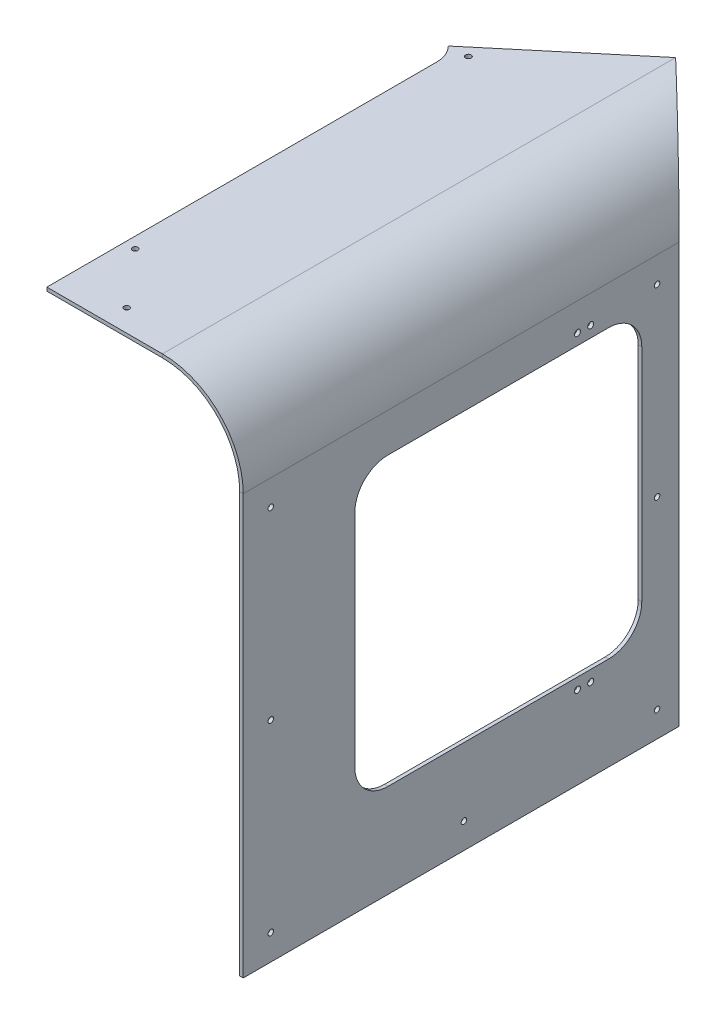
ISO-10303-21;
HEADER;
FILE_DESCRIPTION(('STEP AP214'),'2;1');
FILE_NAME('part.step','',(''),(''),'','','');
FILE_SCHEMA(('AUTOMOTIVE_DESIGN { 1 0 10303 214 1 1 1 1 }'));
ENDSEC;
DATA;
#1=APPLICATION_CONTEXT('core data for automotive mechanical design processes');
#2=APPLICATION_PROTOCOL_DEFINITION('international standard','automotive_design',2000,#1);
#3=PRODUCT_CONTEXT('',#1,'mechanical');
#4=PRODUCT('Part','Part','',(#3));
#5=PRODUCT_RELATED_PRODUCT_CATEGORY('part','',(#4));
#6=PRODUCT_DEFINITION_FORMATION('','',#4);
#7=PRODUCT_DEFINITION_CONTEXT('part definition',#1,'design');
#8=PRODUCT_DEFINITION('design','',#6,#7);
#9=PRODUCT_DEFINITION_SHAPE('','',#8);
#10=(LENGTH_UNIT() NAMED_UNIT(*) SI_UNIT(.MILLI.,.METRE.));
#11=(NAMED_UNIT(*) PLANE_ANGLE_UNIT() SI_UNIT($,.RADIAN.));
#12=(NAMED_UNIT(*) SI_UNIT($,.STERADIAN.) SOLID_ANGLE_UNIT());
#13=UNCERTAINTY_MEASURE_WITH_UNIT(LENGTH_MEASURE(1.E-05),#10,'distance_accuracy_value','');
#14=(GEOMETRIC_REPRESENTATION_CONTEXT(3) GLOBAL_UNCERTAINTY_ASSIGNED_CONTEXT((#13)) GLOBAL_UNIT_ASSIGNED_CONTEXT((#10,
#11,#12)) REPRESENTATION_CONTEXT('',''));
#15=CARTESIAN_POINT('',(0.,0.,0.));
#16=DIRECTION('',(0.,0.,1.));
#17=DIRECTION('',(1.,0.,0.));
#18=AXIS2_PLACEMENT_3D('',#15,#16,#17);
#19=CARTESIAN_POINT('',(320.,84.7775730559616,-265.));
#20=DIRECTION('',(0.,-1.,0.));
#21=DIRECTION('',(0.,0.,-1.));
#22=AXIS2_PLACEMENT_3D('',#19,#20,#21);
#23=PLANE('',#22);
#24=DIRECTION('',(-1.,0.,0.));
#25=VECTOR('',#24,1.);
#26=CARTESIAN_POINT('',(320.,84.7775730559616,138.869715749511));
#27=LINE('',#26,#25);
#28=CARTESIAN_POINT('',(323.2,84.7775730559616,138.869715749511));
#29=VERTEX_POINT('',#28);
#30=CARTESIAN_POINT('',(320.,84.7775730559616,138.869715749511));
#31=VERTEX_POINT('',#30);
#32=EDGE_CURVE('E11',#29,#31,#27,.T.);
#33=ORIENTED_EDGE('',*,*,#32,.F.);
#34=DIRECTION('',(0.,0.,-1.));
#35=VECTOR('',#34,1.);
#36=CARTESIAN_POINT('',(323.2,84.7775730559616,-265.));
#37=LINE('',#36,#35);
#38=CARTESIAN_POINT('',(323.2,84.7775730559616,-61.1302842504891));
#39=VERTEX_POINT('',#38);
#40=EDGE_CURVE('E139',#29,#39,#37,.T.);
#41=ORIENTED_EDGE('',*,*,#40,.T.);
#42=DIRECTION('',(-1.,0.,0.));
#43=VECTOR('',#42,1.);
#44=CARTESIAN_POINT('',(320.,84.7775730559616,-61.1302842504891));
#45=LINE('',#44,#43);
#46=CARTESIAN_POINT('',(320.,84.7775730559616,-61.1302842504891));
#47=VERTEX_POINT('',#46);
#48=EDGE_CURVE('E51',#39,#47,#45,.T.);
#49=ORIENTED_EDGE('',*,*,#48,.T.);
#50=DIRECTION('',(0.,0.,-1.));
#51=VECTOR('',#50,1.);
#52=CARTESIAN_POINT('',(320.,84.7775730559616,-265.));
#53=LINE('',#52,#51);
#54=EDGE_CURVE('E209',#31,#47,#53,.T.);
#55=ORIENTED_EDGE('',*,*,#54,.F.);
#56=EDGE_LOOP('',(#33,#41,#49,#55));
#57=FACE_BOUND('',#56,.T.);
#58=ADVANCED_FACE('F41',(#57),#23,.F.);
#59=CARTESIAN_POINT('',(320.,114.777573055962,-61.1302842504891));
#60=DIRECTION('',(1.,0.,0.));
#61=DIRECTION('',(0.,0.,-1.));
#62=AXIS2_PLACEMENT_3D('',#59,#60,#61);
#63=CYLINDRICAL_SURFACE('',#62,30.);
#64=ORIENTED_EDGE('',*,*,#48,.F.);
#65=CARTESIAN_POINT('',(323.2,114.777573055962,-61.1302842504891));
#66=DIRECTION('',(1.,0.,0.));
#67=DIRECTION('',(0.,0.,-1.));
#68=AXIS2_PLACEMENT_3D('',#65,#66,#67);
#69=CIRCLE('',#68,30.);
#70=CARTESIAN_POINT('',(323.2,114.777573055962,-91.1302842504891));
#71=VERTEX_POINT('',#70);
#72=EDGE_CURVE('E164',#39,#71,#69,.T.);
#73=ORIENTED_EDGE('',*,*,#72,.T.);
#74=DIRECTION('',(-1.,0.,0.));
#75=VECTOR('',#74,1.);
#76=CARTESIAN_POINT('',(320.,114.777573055962,-91.1302842504892));
#77=LINE('',#76,#75);
#78=CARTESIAN_POINT('',(320.,114.777573055962,-91.1302842504892));
#79=VERTEX_POINT('',#78);
#80=EDGE_CURVE('E202',#71,#79,#77,.T.);
#81=ORIENTED_EDGE('',*,*,#80,.T.);
#82=CARTESIAN_POINT('',(320.,114.777573055962,-61.1302842504891));
#83=DIRECTION('',(1.,0.,0.));
#84=DIRECTION('',(0.,0.,-1.));
#85=AXIS2_PLACEMENT_3D('',#82,#83,#84);
#86=CIRCLE('',#85,30.);
#87=EDGE_CURVE('E219',#47,#79,#86,.T.);
#88=ORIENTED_EDGE('',*,*,#87,.F.);
#89=EDGE_LOOP('',(#64,#73,#81,#88));
#90=FACE_BOUND('',#89,.T.);
#91=ADVANCED_FACE('F222',(#90),#63,.F.);
#92=CARTESIAN_POINT('',(320.,450.,-91.1302842504891));
#93=DIRECTION('',(0.,0.,-1.));
#94=DIRECTION('',(0.,1.,0.));
#95=AXIS2_PLACEMENT_3D('',#92,#93,#94);
#96=PLANE('',#95);
#97=ORIENTED_EDGE('',*,*,#80,.F.);
#98=DIRECTION('',(0.,1.,0.));
#99=VECTOR('',#98,1.);
#100=CARTESIAN_POINT('',(323.2,450.,-91.1302842504891));
#101=LINE('',#100,#99);
#102=CARTESIAN_POINT('',(323.2,314.777573055962,-91.1302842504891));
#103=VERTEX_POINT('',#102);
#104=EDGE_CURVE('E161',#71,#103,#101,.T.);
#105=ORIENTED_EDGE('',*,*,#104,.T.);
#106=DIRECTION('',(-1.,0.,0.));
#107=VECTOR('',#106,1.);
#108=CARTESIAN_POINT('',(320.,314.777573055962,-91.1302842504891));
#109=LINE('',#108,#107);
#110=CARTESIAN_POINT('',(320.,314.777573055962,-91.1302842504891));
#111=VERTEX_POINT('',#110);
#112=EDGE_CURVE('E199',#103,#111,#109,.T.);
#113=ORIENTED_EDGE('',*,*,#112,.T.);
#114=DIRECTION('',(0.,1.,0.));
#115=VECTOR('',#114,1.);
#116=CARTESIAN_POINT('',(320.,450.,-91.1302842504891));
#117=LINE('',#116,#115);
#118=EDGE_CURVE('E223',#79,#111,#117,.T.);
#119=ORIENTED_EDGE('',*,*,#118,.F.);
#120=EDGE_LOOP('',(#97,#105,#113,#119));
#121=FACE_BOUND('',#120,.T.);
#122=ADVANCED_FACE('F378',(#121),#96,.F.);
#123=CARTESIAN_POINT('',(320.,314.777573055962,-61.1302842504891));
#124=DIRECTION('',(1.,0.,0.));
#125=DIRECTION('',(0.,0.,-1.));
#126=AXIS2_PLACEMENT_3D('',#123,#124,#125);
#127=CYLINDRICAL_SURFACE('',#126,30.);
#128=ORIENTED_EDGE('',*,*,#112,.F.);
#129=CARTESIAN_POINT('',(323.2,314.777573055962,-61.1302842504891));
#130=DIRECTION('',(1.,0.,0.));
#131=DIRECTION('',(0.,0.,-1.));
#132=AXIS2_PLACEMENT_3D('',#129,#130,#131);
#133=CIRCLE('',#132,30.);
#134=CARTESIAN_POINT('',(323.2,344.777573055962,-61.1302842504891));
#135=VERTEX_POINT('',#134);
#136=EDGE_CURVE('E158',#103,#135,#133,.T.);
#137=ORIENTED_EDGE('',*,*,#136,.T.);
#138=DIRECTION('',(-1.,0.,0.));
#139=VECTOR('',#138,1.);
#140=CARTESIAN_POINT('',(320.,344.777573055962,-61.1302842504891));
#141=LINE('',#140,#139);
#142=CARTESIAN_POINT('',(320.,344.777573055962,-61.1302842504891));
#143=VERTEX_POINT('',#142);
#144=EDGE_CURVE('E196',#135,#143,#141,.T.);
#145=ORIENTED_EDGE('',*,*,#144,.T.);
#146=CARTESIAN_POINT('',(320.,314.777573055962,-61.1302842504891));
#147=DIRECTION('',(1.,0.,0.));
#148=DIRECTION('',(0.,0.,-1.));
#149=AXIS2_PLACEMENT_3D('',#146,#147,#148);
#150=CIRCLE('',#149,30.);
#151=EDGE_CURVE('E225',#111,#143,#150,.T.);
#152=ORIENTED_EDGE('',*,*,#151,.F.);
#153=EDGE_LOOP('',(#128,#137,#145,#152));
#154=FACE_BOUND('',#153,.T.);
#155=ADVANCED_FACE('F384',(#154),#127,.F.);
#156=CARTESIAN_POINT('',(320.,344.777573055962,-265.));
#157=DIRECTION('',(0.,1.,0.));
#158=DIRECTION('',(0.,0.,1.));
#159=AXIS2_PLACEMENT_3D('',#156,#157,#158);
#160=PLANE('',#159);
#161=ORIENTED_EDGE('',*,*,#144,.F.);
#162=DIRECTION('',(0.,0.,-1.));
#163=VECTOR('',#162,1.);
#164=CARTESIAN_POINT('',(323.2,344.777573055962,-265.));
#165=LINE('',#164,#163);
#166=CARTESIAN_POINT('',(323.2,344.777573055962,138.869715749511));
#167=VERTEX_POINT('',#166);
#168=EDGE_CURVE('E155',#135,#167,#165,.F.);
#169=ORIENTED_EDGE('',*,*,#168,.T.);
#170=DIRECTION('',(-1.,0.,0.));
#171=VECTOR('',#170,1.);
#172=CARTESIAN_POINT('',(320.,344.777573055962,138.869715749511));
#173=LINE('',#172,#171);
#174=CARTESIAN_POINT('',(320.,344.777573055962,138.869715749511));
#175=VERTEX_POINT('',#174);
#176=EDGE_CURVE('E193',#167,#175,#173,.T.);
#177=ORIENTED_EDGE('',*,*,#176,.T.);
#178=DIRECTION('',(0.,0.,1.));
#179=VECTOR('',#178,1.);
#180=CARTESIAN_POINT('',(320.,344.777573055962,-265.));
#181=LINE('',#180,#179);
#182=EDGE_CURVE('E231',#143,#175,#181,.T.);
#183=ORIENTED_EDGE('',*,*,#182,.F.);
#184=EDGE_LOOP('',(#161,#169,#177,#183));
#185=FACE_BOUND('',#184,.T.);
#186=ADVANCED_FACE('F387',(#185),#160,.F.);
#187=CARTESIAN_POINT('',(320.,314.777573055962,138.869715749511));
#188=DIRECTION('',(1.,0.,0.));
#189=DIRECTION('',(0.,0.,-1.));
#190=AXIS2_PLACEMENT_3D('',#187,#188,#189);
#191=CYLINDRICAL_SURFACE('',#190,30.);
#192=ORIENTED_EDGE('',*,*,#176,.F.);
#193=CARTESIAN_POINT('',(323.2,314.777573055962,138.869715749511));
#194=DIRECTION('',(1.,0.,0.));
#195=DIRECTION('',(0.,0.,-1.));
#196=AXIS2_PLACEMENT_3D('',#193,#194,#195);
#197=CIRCLE('',#196,30.);
#198=CARTESIAN_POINT('',(323.2,314.777573055962,168.869715749511));
#199=VERTEX_POINT('',#198);
#200=EDGE_CURVE('E152',#167,#199,#197,.T.);
#201=ORIENTED_EDGE('',*,*,#200,.T.);
#202=DIRECTION('',(-1.,0.,0.));
#203=VECTOR('',#202,1.);
#204=CARTESIAN_POINT('',(320.,314.777573055962,168.869715749511));
#205=LINE('',#204,#203);
#206=CARTESIAN_POINT('',(320.,314.777573055962,168.869715749511));
#207=VERTEX_POINT('',#206);
#208=EDGE_CURVE('E129',#199,#207,#205,.T.);
#209=ORIENTED_EDGE('',*,*,#208,.T.);
#210=CARTESIAN_POINT('',(320.,314.777573055962,138.869715749511));
#211=DIRECTION('',(1.,0.,0.));
#212=DIRECTION('',(0.,0.,-1.));
#213=AXIS2_PLACEMENT_3D('',#210,#211,#212);
#214=CIRCLE('',#213,30.);
#215=EDGE_CURVE('E234',#175,#207,#214,.T.);
#216=ORIENTED_EDGE('',*,*,#215,.F.);
#217=EDGE_LOOP('',(#192,#201,#209,#216));
#218=FACE_BOUND('',#217,.T.);
#219=ADVANCED_FACE('F389',(#218),#191,.F.);
#220=CARTESIAN_POINT('',(320.,450.,168.869715749511));
#221=DIRECTION('',(0.,0.,1.));
#222=DIRECTION('',(0.,-1.,0.));
#223=AXIS2_PLACEMENT_3D('',#220,#221,#222);
#224=PLANE('',#223);
#225=ORIENTED_EDGE('',*,*,#208,.F.);
#226=DIRECTION('',(0.,1.,0.));
#227=VECTOR('',#226,1.);
#228=CARTESIAN_POINT('',(323.2,450.,168.869715749511));
#229=LINE('',#228,#227);
#230=CARTESIAN_POINT('',(323.2,114.777573055962,168.869715749511));
#231=VERTEX_POINT('',#230);
#232=EDGE_CURVE('E136',#199,#231,#229,.F.);
#233=ORIENTED_EDGE('',*,*,#232,.T.);
#234=DIRECTION('',(-1.,0.,0.));
#235=VECTOR('',#234,1.);
#236=CARTESIAN_POINT('',(320.,114.777573055962,168.869715749511));
#237=LINE('',#236,#235);
#238=CARTESIAN_POINT('',(320.,114.777573055962,168.869715749511));
#239=VERTEX_POINT('',#238);
#240=EDGE_CURVE('E45',#231,#239,#237,.T.);
#241=ORIENTED_EDGE('',*,*,#240,.T.);
#242=DIRECTION('',(0.,-1.,0.));
#243=VECTOR('',#242,1.);
#244=CARTESIAN_POINT('',(320.,450.,168.869715749511));
#245=LINE('',#244,#243);
#246=EDGE_CURVE('E311',#207,#239,#245,.T.);
#247=ORIENTED_EDGE('',*,*,#246,.F.);
#248=EDGE_LOOP('',(#225,#233,#241,#247));
#249=FACE_BOUND('',#248,.T.);
#250=ADVANCED_FACE('F141',(#249),#224,.F.);
#251=CARTESIAN_POINT('',(145.271732748,450.,195.));
#252=DIRECTION('',(1.,0.,0.));
#253=DIRECTION('',(0.,0.,-1.));
#254=AXIS2_PLACEMENT_3D('',#251,#252,#253);
#255=PLANE('',#254);
#256=DIRECTION('',(0.,-1.,0.));
#257=VECTOR('',#256,1.);
#258=CARTESIAN_POINT('',(145.271732748,450.,270.));
#259=LINE('',#258,#257);
#260=CARTESIAN_POINT('',(145.271732748,453.2,270.));
#261=VERTEX_POINT('',#260);
#262=CARTESIAN_POINT('',(145.271732748,450.,270.));
#263=VERTEX_POINT('',#262);
#264=EDGE_CURVE('E130',#261,#263,#259,.T.);
#265=ORIENTED_EDGE('',*,*,#264,.F.);
#266=DIRECTION('',(0.,0.,1.));
#267=VECTOR('',#266,1.);
#268=CARTESIAN_POINT('',(145.271732748,453.2,195.));
#269=LINE('',#268,#267);
#270=CARTESIAN_POINT('',(145.271732748,453.2,-83.3962275514645));
#271=VERTEX_POINT('',#270);
#272=EDGE_CURVE('E315',#261,#271,#269,.F.);
#273=ORIENTED_EDGE('',*,*,#272,.T.);
#274=DIRECTION('',(0.,-1.,0.));
#275=VECTOR('',#274,1.);
#276=CARTESIAN_POINT('',(145.271732748,450.,-83.3962275514645));
#277=LINE('',#276,#275);
#278=CARTESIAN_POINT('',(145.271732748,450.,-83.3962275514645));
#279=VERTEX_POINT('',#278);
#280=EDGE_CURVE('E185',#271,#279,#277,.T.);
#281=ORIENTED_EDGE('',*,*,#280,.T.);
#282=DIRECTION('',(0.,0.,-1.));
#283=VECTOR('',#282,1.);
#284=CARTESIAN_POINT('',(145.271732748,450.,195.));
#285=LINE('',#284,#283);
#286=EDGE_CURVE('E268',#263,#279,#285,.T.);
#287=ORIENTED_EDGE('',*,*,#286,.F.);
#288=EDGE_LOOP('',(#265,#273,#281,#287));
#289=FACE_BOUND('',#288,.T.);
#290=ADVANCED_FACE('F342',(#289),#255,.F.);
#291=CARTESIAN_POINT('',(120.271732748,450.,-83.3962275514645));
#292=DIRECTION('',(0.,1.,0.));
#293=DIRECTION('',(0.,0.,1.));
#294=AXIS2_PLACEMENT_3D('',#291,#292,#293);
#295=CYLINDRICAL_SURFACE('',#294,25.);
#296=ORIENTED_EDGE('',*,*,#280,.F.);
#297=CARTESIAN_POINT('',(120.271732748,453.2,-83.3962275514645));
#298=DIRECTION('',(0.,1.,0.));
#299=DIRECTION('',(0.,0.,1.));
#300=AXIS2_PLACEMENT_3D('',#297,#298,#299);
#301=CIRCLE('',#300,25.);
#302=CARTESIAN_POINT('',(137.949402277664,453.2,-101.073897081128));
#303=VERTEX_POINT('',#302);
#304=EDGE_CURVE('E297',#271,#303,#301,.T.);
#305=ORIENTED_EDGE('',*,*,#304,.T.);
#306=DIRECTION('',(0.,-1.,0.));
#307=VECTOR('',#306,1.);
#308=CARTESIAN_POINT('',(137.949402277664,450.,-101.073897081128));
#309=LINE('',#308,#307);
#310=CARTESIAN_POINT('',(137.949402277664,450.,-101.073897081128));
#311=VERTEX_POINT('',#310);
#312=EDGE_CURVE('E59',#303,#311,#309,.T.);
#313=ORIENTED_EDGE('',*,*,#312,.T.);
#314=CARTESIAN_POINT('',(120.271732748,450.,-83.3962275514645));
#315=DIRECTION('',(0.,1.,0.));
#316=DIRECTION('',(0.,0.,1.));
#317=AXIS2_PLACEMENT_3D('',#314,#315,#316);
#318=CIRCLE('',#317,25.);
#319=EDGE_CURVE('E273',#279,#311,#318,.T.);
#320=ORIENTED_EDGE('',*,*,#319,.F.);
#321=EDGE_LOOP('',(#296,#305,#313,#320));
#322=FACE_BOUND('',#321,.T.);
#323=ADVANCED_FACE('F339',(#322),#295,.F.);
#324=CARTESIAN_POINT('',(-235.661957548569,450.,212.104789583773));
#325=DIRECTION('',(-0.642404184639349,0.,-0.766366011483973));
#326=DIRECTION('',(-0.766366011483973,0.,0.642404184639349));
#327=AXIS2_PLACEMENT_3D('',#324,#325,#326);
#328=PLANE('',#327);
#329=ORIENTED_EDGE('',*,*,#312,.F.);
#330=DIRECTION('',(-0.766366011483973,0.,0.642404184639349));
#331=VECTOR('',#330,1.);
#332=CARTESIAN_POINT('',(-235.661957548569,453.2,212.104789583773));
#333=LINE('',#332,#331);
#334=CARTESIAN_POINT('',(250.,453.2,-195.));
#335=VERTEX_POINT('',#334);
#336=EDGE_CURVE('E291',#335,#303,#333,.T.);
#337=ORIENTED_EDGE('',*,*,#336,.F.);
#338=DIRECTION('',(0.,-1.,0.));
#339=VECTOR('',#338,1.);
#340=CARTESIAN_POINT('',(250.,450.,-195.));
#341=LINE('',#340,#339);
#342=CARTESIAN_POINT('',(250.,450.,-195.));
#343=VERTEX_POINT('',#342);
#344=EDGE_CURVE('E181',#335,#343,#341,.T.);
#345=ORIENTED_EDGE('',*,*,#344,.T.);
#346=DIRECTION('',(-0.766366011483973,0.,0.642404184639349));
#347=VECTOR('',#346,1.);
#348=CARTESIAN_POINT('',(-235.661957548569,450.,212.104789583773));
#349=LINE('',#348,#347);
#350=EDGE_CURVE('E258',#343,#311,#349,.T.);
#351=ORIENTED_EDGE('',*,*,#350,.T.);
#352=EDGE_LOOP('',(#329,#337,#345,#351));
#353=FACE_BOUND('',#352,.T.);
#354=ADVANCED_FACE('F510',(#353),#328,.T.);
#355=CARTESIAN_POINT('',(323.2,380.,-125.));
#356=CARTESIAN_POINT('',(322.133333333333,380.,-125.));
#357=CARTESIAN_POINT('',(321.066666666667,380.,-125.));
#358=CARTESIAN_POINT('',(320.,380.,-125.));
#359=CARTESIAN_POINT('',(323.2,526.4,-125.));
#360=CARTESIAN_POINT('',(322.133333333333,524.266666666667,-125.));
#361=CARTESIAN_POINT('',(321.066666666667,522.133333333334,-125.));
#362=CARTESIAN_POINT('',(320.,520.,-125.));
#363=CARTESIAN_POINT('',(176.8,526.4,-265.));
#364=CARTESIAN_POINT('',(177.866666666667,524.266666666667,-265.));
#365=CARTESIAN_POINT('',(178.933333333333,522.133333333334,-265.));
#366=CARTESIAN_POINT('',(180.,520.,-265.));
#367=CARTESIAN_POINT('',(176.8,380.,-265.));
#368=CARTESIAN_POINT('',(177.866666666667,380.,-265.));
#369=CARTESIAN_POINT('',(178.933333333333,380.,-265.));
#370=CARTESIAN_POINT('',(180.,380.,-265.));
#371=CARTESIAN_POINT('',(176.8,233.6,-265.));
#372=CARTESIAN_POINT('',(177.866666666667,235.733333333333,-265.));
#373=CARTESIAN_POINT('',(178.933333333333,237.866666666667,-265.));
#374=CARTESIAN_POINT('',(180.,240.,-265.));
#375=CARTESIAN_POINT('',(323.2,233.6,-125.));
#376=CARTESIAN_POINT('',(322.133333333333,235.733333333333,-125.));
#377=CARTESIAN_POINT('',(321.066666666667,237.866666666667,-125.));
#378=CARTESIAN_POINT('',(320.,240.,-125.));
#379=CARTESIAN_POINT('',(323.2,380.,-125.));
#380=CARTESIAN_POINT('',(322.133333333333,380.,-125.));
#381=CARTESIAN_POINT('',(321.066666666667,380.,-125.));
#382=CARTESIAN_POINT('',(320.,380.,-125.));
#383=(BOUNDED_SURFACE() B_SPLINE_SURFACE(3,3,((#355,#356,#357,#358),(#359,#360,#361,#362),(#363,
#364,#365,#366),(#367,#368,#369,#370),(#371,#372,#373,#374),(#375,#376,#377,#378),(#379,#380,
#381,#382)),.UNSPECIFIED.,.T.,.F.,.F.) B_SPLINE_SURFACE_WITH_KNOTS((4,3,4),(4,4),(0.,0.5,1.),
(0.,1.),.UNSPECIFIED.) GEOMETRIC_REPRESENTATION_ITEM() RATIONAL_B_SPLINE_SURFACE(((1.,1.,1.,1.),
(0.333333333333333,0.333333333333333,0.333333333333333,0.333333333333333),(0.333333333333333,
0.333333333333333,0.333333333333333,0.333333333333333),(1.,1.,1.,1.),(0.333333333333333,
0.333333333333333,0.333333333333333,0.333333333333333),(0.333333333333333,0.333333333333333,
0.333333333333333,0.333333333333333),(1.,1.,1.,1.))) REPRESENTATION_ITEM('') SURFACE());
#384=CARTESIAN_POINT('',(250.,380.,-195.));
#385=DIRECTION('',(0.691132971722828,0.,-0.722727621858729));
#386=DIRECTION('',(0.722727621858729,0.,0.691132971722828));
#387=AXIS2_PLACEMENT_3D('',#384,#385,#386);
#388=ELLIPSE('',#387,101.282969940657,73.2);
#389=CARTESIAN_POINT('',(323.2,380.,-125.));
#390=VERTEX_POINT('',#389);
#391=EDGE_CURVE('E296',#390,#335,#388,.F.);
#392=DIRECTION('',(-1.,0.,0.));
#393=VECTOR('',#392,1.);
#394=CARTESIAN_POINT('',(320.,380.,-125.));
#395=LINE('',#394,#393);
#396=CARTESIAN_POINT('',(320.,380.,-125.));
#397=VERTEX_POINT('',#396);
#398=EDGE_CURVE('E178',#390,#397,#395,.T.);
#399=CARTESIAN_POINT('',(250.,380.,-195.));
#400=DIRECTION('',(0.707106781186547,0.,-0.707106781186548));
#401=DIRECTION('',(0.707106781186548,0.,0.707106781186547));
#402=AXIS2_PLACEMENT_3D('',#399,#400,#401);
#403=ELLIPSE('',#402,98.9949493661167,70.);
#404=EDGE_CURVE('E191',#397,#343,#403,.F.);
#405=ORIENTED_EDGE('',*,*,#344,.F.);
#406=ORIENTED_EDGE('',*,*,#391,.F.);
#407=ORIENTED_EDGE('',*,*,#398,.T.);
#408=ORIENTED_EDGE('',*,*,#404,.T.);
#409=EDGE_LOOP('',(#405,#406,#407,#408));
#410=FACE_BOUND('',#409,.T.);
#411=ADVANCED_FACE('F515',(#410),#383,.F.);
#412=CARTESIAN_POINT('',(320.,2193.73346549275,-125.));
#413=DIRECTION('',(0.,0.,1.));
#414=DIRECTION('',(0.,-1.,0.));
#415=AXIS2_PLACEMENT_3D('',#412,#413,#414);
#416=PLANE('',#415);
#417=ORIENTED_EDGE('',*,*,#398,.F.);
#418=DIRECTION('',(0.,1.,0.));
#419=VECTOR('',#418,1.);
#420=CARTESIAN_POINT('',(323.2,450.,-125.));
#421=LINE('',#420,#419);
#422=CARTESIAN_POINT('',(323.2,8.88178419700125E-13,-125.));
#423=VERTEX_POINT('',#422);
#424=EDGE_CURVE('E285',#390,#423,#421,.F.);
#425=ORIENTED_EDGE('',*,*,#424,.T.);
#426=DIRECTION('',(-1.,0.,0.));
#427=VECTOR('',#426,1.);
#428=CARTESIAN_POINT('',(320.,8.88178419700125E-13,-125.));
#429=LINE('',#428,#427);
#430=CARTESIAN_POINT('',(320.,8.88178419700125E-13,-125.));
#431=VERTEX_POINT('',#430);
#432=EDGE_CURVE('E175',#423,#431,#429,.T.);
#433=ORIENTED_EDGE('',*,*,#432,.T.);
#434=DIRECTION('',(0.,-1.,0.));
#435=VECTOR('',#434,1.);
#436=CARTESIAN_POINT('',(320.,2193.73346549275,-125.));
#437=LINE('',#436,#435);
#438=EDGE_CURVE('E248',#397,#431,#437,.T.);
#439=ORIENTED_EDGE('',*,*,#438,.F.);
#440=EDGE_LOOP('',(#417,#425,#433,#439));
#441=FACE_BOUND('',#440,.T.);
#442=ADVANCED_FACE('F520',(#441),#416,.F.);
#443=CARTESIAN_POINT('',(320.,0.,-265.));
#444=DIRECTION('',(0.,1.,0.));
#445=DIRECTION('',(0.,0.,1.));
#446=AXIS2_PLACEMENT_3D('',#443,#444,#445);
#447=PLANE('',#446);
#448=ORIENTED_EDGE('',*,*,#432,.F.);
#449=DIRECTION('',(0.,0.,-1.));
#450=VECTOR('',#449,1.);
#451=CARTESIAN_POINT('',(323.2,8.88178419700125E-13,-265.));
#452=LINE('',#451,#450);
#453=CARTESIAN_POINT('',(323.2,0.,270.));
#454=VERTEX_POINT('',#453);
#455=EDGE_CURVE('E154',#423,#454,#452,.F.);
#456=ORIENTED_EDGE('',*,*,#455,.T.);
#457=DIRECTION('',(-1.,0.,0.));
#458=VECTOR('',#457,1.);
#459=CARTESIAN_POINT('',(320.,0.,270.));
#460=LINE('',#459,#458);
#461=CARTESIAN_POINT('',(320.,0.,270.));
#462=VERTEX_POINT('',#461);
#463=EDGE_CURVE('E171',#454,#462,#460,.T.);
#464=ORIENTED_EDGE('',*,*,#463,.T.);
#465=DIRECTION('',(0.,0.,1.));
#466=VECTOR('',#465,1.);
#467=CARTESIAN_POINT('',(320.,0.,-265.));
#468=LINE('',#467,#466);
#469=EDGE_CURVE('E237',#431,#462,#468,.T.);
#470=ORIENTED_EDGE('',*,*,#469,.F.);
#471=EDGE_LOOP('',(#448,#456,#464,#470));
#472=FACE_BOUND('',#471,.T.);
#473=ADVANCED_FACE('F529',(#472),#447,.F.);
#474=CARTESIAN_POINT('',(320.,0.,270.));
#475=DIRECTION('',(0.,0.,1.));
#476=DIRECTION('',(0.,-1.,0.));
#477=AXIS2_PLACEMENT_3D('',#474,#475,#476);
#478=PLANE('',#477);
#479=ORIENTED_EDGE('',*,*,#463,.F.);
#480=DIRECTION('',(0.,1.,0.));
#481=VECTOR('',#480,1.);
#482=CARTESIAN_POINT('',(323.2,450.,269.999999999309));
#483=LINE('',#482,#481);
#484=CARTESIAN_POINT('',(323.2,380.,269.999999999309));
#485=VERTEX_POINT('',#484);
#486=EDGE_CURVE('E286',#485,#454,#483,.F.);
#487=ORIENTED_EDGE('',*,*,#486,.F.);
#488=DIRECTION('',(-1.,0.,0.));
#489=VECTOR('',#488,1.);
#490=CARTESIAN_POINT('',(320.,380.,269.999999999309));
#491=LINE('',#490,#489);
#492=CARTESIAN_POINT('',(320.,380.,269.999999999309));
#493=VERTEX_POINT('',#492);
#494=EDGE_CURVE('E168',#485,#493,#491,.T.);
#495=ORIENTED_EDGE('',*,*,#494,.T.);
#496=DIRECTION('',(0.,-1.,0.));
#497=VECTOR('',#496,1.);
#498=CARTESIAN_POINT('',(320.,0.,270.));
#499=LINE('',#498,#497);
#500=EDGE_CURVE('E241',#493,#462,#499,.T.);
#501=ORIENTED_EDGE('',*,*,#500,.T.);
#502=EDGE_LOOP('',(#479,#487,#495,#501));
#503=FACE_BOUND('',#502,.T.);
#504=ADVANCED_FACE('F533',(#503),#478,.T.);
#505=CARTESIAN_POINT('',(250.,380.,269.999999998618));
#506=DIRECTION('',(0.,0.,-1.));
#507=DIRECTION('',(-1.,0.,0.));
#508=AXIS2_PLACEMENT_3D('',#505,#506,#507);
#509=PLANE('',#508);
#510=ORIENTED_EDGE('',*,*,#494,.F.);
#511=CARTESIAN_POINT('',(250.,380.,269.999999999309));
#512=DIRECTION('',(0.,0.,1.));
#513=DIRECTION('',(1.,0.,0.));
#514=AXIS2_PLACEMENT_3D('',#511,#512,#513);
#515=CIRCLE('',#514,73.2);
#516=CARTESIAN_POINT('',(250.,453.2,269.999999999309));
#517=VERTEX_POINT('',#516);
#518=EDGE_CURVE('E292',#517,#485,#515,.F.);
#519=ORIENTED_EDGE('',*,*,#518,.F.);
#520=DIRECTION('',(0.,-1.,0.));
#521=VECTOR('',#520,1.);
#522=CARTESIAN_POINT('',(250.,450.,269.999999999309));
#523=LINE('',#522,#521);
#524=CARTESIAN_POINT('',(250.,450.,269.999999999309));
#525=VERTEX_POINT('',#524);
#526=EDGE_CURVE('E172',#517,#525,#523,.T.);
#527=ORIENTED_EDGE('',*,*,#526,.T.);
#528=CARTESIAN_POINT('',(250.,380.,269.999999998618));
#529=DIRECTION('',(0.,0.,1.));
#530=DIRECTION('',(1.,0.,0.));
#531=AXIS2_PLACEMENT_3D('',#528,#529,#530);
#532=CIRCLE('',#531,70.);
#533=EDGE_CURVE('E275',#525,#493,#532,.F.);
#534=ORIENTED_EDGE('',*,*,#533,.T.);
#535=EDGE_LOOP('',(#510,#519,#527,#534));
#536=FACE_BOUND('',#535,.T.);
#537=ADVANCED_FACE('F537',(#536),#509,.F.);
#538=CARTESIAN_POINT('',(320.,114.777573055962,138.869715749511));
#539=DIRECTION('',(1.,0.,0.));
#540=DIRECTION('',(0.,0.,-1.));
#541=AXIS2_PLACEMENT_3D('',#538,#539,#540);
#542=CYLINDRICAL_SURFACE('',#541,30.);
#543=CARTESIAN_POINT('',(323.2,114.777573055962,138.869715749511));
#544=DIRECTION('',(1.,0.,0.));
#545=DIRECTION('',(0.,0.,-1.));
#546=AXIS2_PLACEMENT_3D('',#543,#544,#545);
#547=CIRCLE('',#546,30.);
#548=EDGE_CURVE('E122',#231,#29,#547,.T.);
#549=ORIENTED_EDGE('',*,*,#548,.T.);
#550=ORIENTED_EDGE('',*,*,#32,.T.);
#551=CARTESIAN_POINT('',(320.,114.777573055962,138.869715749511));
#552=DIRECTION('',(1.,0.,0.));
#553=DIRECTION('',(0.,0.,-1.));
#554=AXIS2_PLACEMENT_3D('',#551,#552,#553);
#555=CIRCLE('',#554,30.);
#556=EDGE_CURVE('E124',#239,#31,#555,.T.);
#557=ORIENTED_EDGE('',*,*,#556,.F.);
#558=ORIENTED_EDGE('',*,*,#240,.F.);
#559=EDGE_LOOP('',(#549,#550,#557,#558));
#560=FACE_BOUND('',#559,.T.);
#561=ADVANCED_FACE('F43',(#560),#542,.F.);
#562=CARTESIAN_POINT('',(155.271732748,450.,-101.960676968146));
#563=DIRECTION('',(0.,1.,0.));
#564=DIRECTION('',(0.,0.,1.));
#565=AXIS2_PLACEMENT_3D('',#562,#563,#564);
#566=CYLINDRICAL_SURFACE('',#565,2.5);
#567=CARTESIAN_POINT('',(155.271732748,450.,-101.960676968146));
#568=DIRECTION('',(0.,1.,0.));
#569=DIRECTION('',(0.,0.,1.));
#570=AXIS2_PLACEMENT_3D('',#567,#568,#569);
#571=CIRCLE('',#570,2.5);
#572=CARTESIAN_POINT('',(155.271732748,450.,-99.4606769681461));
#573=VERTEX_POINT('',#572);
#574=EDGE_CURVE('E252',#573,#573,#571,.T.);
#575=ORIENTED_EDGE('',*,*,#574,.F.);
#576=EDGE_LOOP('',(#575));
#577=FACE_BOUND('',#576,.T.);
#578=CARTESIAN_POINT('',(155.271732748,453.2,-101.960676968146));
#579=DIRECTION('',(0.,1.,0.));
#580=DIRECTION('',(0.,0.,1.));
#581=AXIS2_PLACEMENT_3D('',#578,#579,#580);
#582=CIRCLE('',#581,2.5);
#583=CARTESIAN_POINT('',(155.271732748,453.2,-99.4606769681461));
#584=VERTEX_POINT('',#583);
#585=EDGE_CURVE('E307',#584,#584,#582,.T.);
#586=ORIENTED_EDGE('',*,*,#585,.T.);
#587=EDGE_LOOP('',(#586));
#588=FACE_BOUND('',#587,.T.);
#589=ADVANCED_FACE('F479',(#577,#588),#566,.F.);
#590=CARTESIAN_POINT('',(155.271732748,450.,200.));
#591=DIRECTION('',(0.,1.,0.));
#592=DIRECTION('',(0.,0.,1.));
#593=AXIS2_PLACEMENT_3D('',#590,#591,#592);
#594=CYLINDRICAL_SURFACE('',#593,2.5);
#595=CARTESIAN_POINT('',(155.271732748,450.,200.));
#596=DIRECTION('',(0.,1.,0.));
#597=DIRECTION('',(0.,0.,1.));
#598=AXIS2_PLACEMENT_3D('',#595,#596,#597);
#599=CIRCLE('',#598,2.5);
#600=CARTESIAN_POINT('',(155.271732748,450.,202.5));
#601=VERTEX_POINT('',#600);
#602=EDGE_CURVE('E255',#601,#601,#599,.T.);
#603=ORIENTED_EDGE('',*,*,#602,.F.);
#604=EDGE_LOOP('',(#603));
#605=FACE_BOUND('',#604,.T.);
#606=CARTESIAN_POINT('',(155.271732748,453.2,200.));
#607=DIRECTION('',(0.,1.,0.));
#608=DIRECTION('',(0.,0.,1.));
#609=AXIS2_PLACEMENT_3D('',#606,#607,#608);
#610=CIRCLE('',#609,2.5);
#611=CARTESIAN_POINT('',(155.271732748,453.2,202.5));
#612=VERTEX_POINT('',#611);
#613=EDGE_CURVE('E150',#612,#612,#610,.T.);
#614=ORIENTED_EDGE('',*,*,#613,.T.);
#615=EDGE_LOOP('',(#614));
#616=FACE_BOUND('',#615,.T.);
#617=ADVANCED_FACE('F326',(#605,#616),#594,.F.);
#618=CARTESIAN_POINT('',(-250.,450.,270.));
#619=DIRECTION('',(0.,0.,1.));
#620=DIRECTION('',(1.,0.,0.));
#621=AXIS2_PLACEMENT_3D('',#618,#619,#620);
#622=PLANE('',#621);
#623=DIRECTION('',(1.,0.,0.));
#624=VECTOR('',#623,1.);
#625=CARTESIAN_POINT('',(-250.,453.2,270.));
#626=LINE('',#625,#624);
#627=EDGE_CURVE('E290',#261,#517,#626,.T.);
#628=ORIENTED_EDGE('',*,*,#627,.F.);
#629=ORIENTED_EDGE('',*,*,#264,.T.);
#630=DIRECTION('',(1.,0.,0.));
#631=VECTOR('',#630,1.);
#632=CARTESIAN_POINT('',(-250.,450.,270.));
#633=LINE('',#632,#631);
#634=EDGE_CURVE('E264',#263,#525,#633,.T.);
#635=ORIENTED_EDGE('',*,*,#634,.T.);
#636=ORIENTED_EDGE('',*,*,#526,.F.);
#637=EDGE_LOOP('',(#628,#629,#635,#636));
#638=FACE_BOUND('',#637,.T.);
#639=ADVANCED_FACE('F351',(#638),#622,.T.);
#640=CARTESIAN_POINT('',(250.,380.,-265.));
#641=DIRECTION('',(0.,0.,1.));
#642=DIRECTION('',(1.,0.,0.));
#643=AXIS2_PLACEMENT_3D('',#640,#641,#642);
#644=CYLINDRICAL_SURFACE('',#643,70.);
#645=DIRECTION('',(0.,0.,1.));
#646=VECTOR('',#645,1.);
#647=CARTESIAN_POINT('',(320.,380.,-265.));
#648=LINE('',#647,#646);
#649=EDGE_CURVE('E245',#397,#493,#648,.T.);
#650=ORIENTED_EDGE('',*,*,#649,.T.);
#651=ORIENTED_EDGE('',*,*,#533,.F.);
#652=DIRECTION('',(0.,0.,1.));
#653=VECTOR('',#652,1.);
#654=CARTESIAN_POINT('',(250.,450.,195.));
#655=LINE('',#654,#653);
#656=EDGE_CURVE('E261',#525,#343,#655,.F.);
#657=ORIENTED_EDGE('',*,*,#656,.T.);
#658=ORIENTED_EDGE('',*,*,#404,.F.);
#659=EDGE_LOOP('',(#650,#651,#657,#658));
#660=FACE_BOUND('',#659,.T.);
#661=ADVANCED_FACE('F472',(#660),#644,.F.);
#662=CARTESIAN_POINT('',(-250.,450.,195.));
#663=DIRECTION('',(0.,1.,0.));
#664=DIRECTION('',(0.,0.,1.));
#665=AXIS2_PLACEMENT_3D('',#662,#663,#664);
#666=PLANE('',#665);
#667=CARTESIAN_POINT('',(197.635866374,450.,250.));
#668=DIRECTION('',(0.,1.,0.));
#669=DIRECTION('',(0.,0.,1.));
#670=AXIS2_PLACEMENT_3D('',#667,#668,#669);
#671=CIRCLE('',#670,2.5);
#672=CARTESIAN_POINT('',(197.635866374,450.,252.5));
#673=VERTEX_POINT('',#672);
#674=EDGE_CURVE('E455',#673,#673,#671,.T.);
#675=ORIENTED_EDGE('',*,*,#674,.T.);
#676=EDGE_LOOP('',(#675));
#677=FACE_BOUND('',#676,.T.);
#678=ORIENTED_EDGE('',*,*,#574,.T.);
#679=EDGE_LOOP('',(#678));
#680=FACE_BOUND('',#679,.T.);
#681=ORIENTED_EDGE('',*,*,#602,.T.);
#682=EDGE_LOOP('',(#681));
#683=FACE_BOUND('',#682,.T.);
#684=ORIENTED_EDGE('',*,*,#350,.F.);
#685=ORIENTED_EDGE('',*,*,#656,.F.);
#686=ORIENTED_EDGE('',*,*,#634,.F.);
#687=ORIENTED_EDGE('',*,*,#286,.T.);
#688=ORIENTED_EDGE('',*,*,#319,.T.);
#689=EDGE_LOOP('',(#684,#685,#686,#687,#688));
#690=FACE_BOUND('',#689,.T.);
#691=ADVANCED_FACE('F346',(#677,#680,#683,#690),#666,.F.);
#692=CARTESIAN_POINT('',(320.,450.,-265.));
#693=DIRECTION('',(1.,0.,0.));
#694=DIRECTION('',(0.,0.,-1.));
#695=AXIS2_PLACEMENT_3D('',#692,#693,#694);
#696=PLANE('',#695);
#697=CARTESIAN_POINT('',(320.,356.825,-105.));
#698=DIRECTION('',(1.,0.,0.));
#699=DIRECTION('',(0.,0.,-1.));
#700=AXIS2_PLACEMENT_3D('',#697,#698,#699);
#701=CIRCLE('',#700,2.5);
#702=CARTESIAN_POINT('',(320.,356.825,-107.5));
#703=VERTEX_POINT('',#702);
#704=EDGE_CURVE('E449',#703,#703,#701,.T.);
#705=ORIENTED_EDGE('',*,*,#704,.T.);
#706=EDGE_LOOP('',(#705));
#707=FACE_BOUND('',#706,.T.);
#708=CARTESIAN_POINT('',(320.,190.,-105.));
#709=DIRECTION('',(1.,0.,0.));
#710=DIRECTION('',(0.,0.,-1.));
#711=AXIS2_PLACEMENT_3D('',#708,#709,#710);
#712=CIRCLE('',#711,2.50000000000001);
#713=CARTESIAN_POINT('',(320.,190.,-107.5));
#714=VERTEX_POINT('',#713);
#715=EDGE_CURVE('E443',#714,#714,#712,.T.);
#716=ORIENTED_EDGE('',*,*,#715,.T.);
#717=EDGE_LOOP('',(#716));
#718=FACE_BOUND('',#717,.T.);
#719=CARTESIAN_POINT('',(320.,190.,245.024999999309));
#720=DIRECTION('',(1.,0.,0.));
#721=DIRECTION('',(0.,0.,-1.));
#722=AXIS2_PLACEMENT_3D('',#719,#720,#721);
#723=CIRCLE('',#722,2.5);
#724=CARTESIAN_POINT('',(320.,190.,242.524999999309));
#725=VERTEX_POINT('',#724);
#726=EDGE_CURVE('E437',#725,#725,#723,.T.);
#727=ORIENTED_EDGE('',*,*,#726,.T.);
#728=EDGE_LOOP('',(#727));
#729=FACE_BOUND('',#728,.T.);
#730=CARTESIAN_POINT('',(320.,356.825,245.024999999309));
#731=DIRECTION('',(1.,0.,0.));
#732=DIRECTION('',(0.,0.,-1.));
#733=AXIS2_PLACEMENT_3D('',#730,#731,#732);
#734=CIRCLE('',#733,2.5);
#735=CARTESIAN_POINT('',(320.,356.825,242.524999999309));
#736=VERTEX_POINT('',#735);
#737=EDGE_CURVE('E431',#736,#736,#734,.T.);
#738=ORIENTED_EDGE('',*,*,#737,.T.);
#739=EDGE_LOOP('',(#738));
#740=FACE_BOUND('',#739,.T.);
#741=CARTESIAN_POINT('',(320.,23.1750000000009,-105.));
#742=DIRECTION('',(1.,0.,0.));
#743=DIRECTION('',(0.,0.,-1.));
#744=AXIS2_PLACEMENT_3D('',#741,#742,#743);
#745=CIRCLE('',#744,2.50000000000001);
#746=CARTESIAN_POINT('',(320.,23.1750000000009,-107.5));
#747=VERTEX_POINT('',#746);
#748=EDGE_CURVE('E425',#747,#747,#745,.T.);
#749=ORIENTED_EDGE('',*,*,#748,.T.);
#750=EDGE_LOOP('',(#749));
#751=FACE_BOUND('',#750,.T.);
#752=CARTESIAN_POINT('',(320.,23.1750000000009,70.0124999996544));
#753=DIRECTION('',(1.,0.,0.));
#754=DIRECTION('',(0.,0.,-1.));
#755=AXIS2_PLACEMENT_3D('',#752,#753,#754);
#756=CIRCLE('',#755,2.5);
#757=CARTESIAN_POINT('',(320.,23.1750000000009,67.5124999996544));
#758=VERTEX_POINT('',#757);
#759=EDGE_CURVE('E419',#758,#758,#756,.T.);
#760=ORIENTED_EDGE('',*,*,#759,.T.);
#761=EDGE_LOOP('',(#760));
#762=FACE_BOUND('',#761,.T.);
#763=CARTESIAN_POINT('',(320.,23.1750000000009,245.024999999309));
#764=DIRECTION('',(1.,0.,0.));
#765=DIRECTION('',(0.,0.,-1.));
#766=AXIS2_PLACEMENT_3D('',#763,#764,#765);
#767=CIRCLE('',#766,2.5);
#768=CARTESIAN_POINT('',(320.,23.1750000000009,242.524999999309));
#769=VERTEX_POINT('',#768);
#770=EDGE_CURVE('E413',#769,#769,#767,.T.);
#771=ORIENTED_EDGE('',*,*,#770,.T.);
#772=EDGE_LOOP('',(#771));
#773=FACE_BOUND('',#772,.T.);
#774=CARTESIAN_POINT('',(320.,354.777573121186,-32.8802842504893));
#775=DIRECTION('',(1.,0.,0.));
#776=DIRECTION('',(0.,0.,-1.));
#777=AXIS2_PLACEMENT_3D('',#774,#775,#776);
#778=CIRCLE('',#777,2.75);
#779=CARTESIAN_POINT('',(320.,354.777573121186,-35.6302842504893));
#780=VERTEX_POINT('',#779);
#781=EDGE_CURVE('E407',#780,#780,#778,.T.);
#782=ORIENTED_EDGE('',*,*,#781,.T.);
#783=EDGE_LOOP('',(#782));
#784=FACE_BOUND('',#783,.T.);
#785=CARTESIAN_POINT('',(320.,354.777573121186,-44.8802842504893));
#786=DIRECTION('',(1.,0.,0.));
#787=DIRECTION('',(0.,0.,-1.));
#788=AXIS2_PLACEMENT_3D('',#785,#786,#787);
#789=CIRCLE('',#788,2.75);
#790=CARTESIAN_POINT('',(320.,354.777573121186,-47.6302842504893));
#791=VERTEX_POINT('',#790);
#792=EDGE_CURVE('E401',#791,#791,#789,.T.);
#793=ORIENTED_EDGE('',*,*,#792,.T.);
#794=EDGE_LOOP('',(#793));
#795=FACE_BOUND('',#794,.T.);
#796=CARTESIAN_POINT('',(320.,74.7775730559616,-32.8802842504893));
#797=DIRECTION('',(1.,0.,0.));
#798=DIRECTION('',(0.,0.,-1.));
#799=AXIS2_PLACEMENT_3D('',#796,#797,#798);
#800=CIRCLE('',#799,2.75);
#801=CARTESIAN_POINT('',(320.,74.7775730559616,-35.6302842504893));
#802=VERTEX_POINT('',#801);
#803=EDGE_CURVE('E395',#802,#802,#800,.T.);
#804=ORIENTED_EDGE('',*,*,#803,.T.);
#805=EDGE_LOOP('',(#804));
#806=FACE_BOUND('',#805,.T.);
#807=CARTESIAN_POINT('',(320.,74.7775730559616,-44.8802842504893));
#808=DIRECTION('',(1.,0.,0.));
#809=DIRECTION('',(0.,0.,-1.));
#810=AXIS2_PLACEMENT_3D('',#807,#808,#809);
#811=CIRCLE('',#810,2.75);
#812=CARTESIAN_POINT('',(320.,74.7775730559616,-47.6302842504893));
#813=VERTEX_POINT('',#812);
#814=EDGE_CURVE('E143',#813,#813,#811,.T.);
#815=ORIENTED_EDGE('',*,*,#814,.T.);
#816=EDGE_LOOP('',(#815));
#817=FACE_BOUND('',#816,.T.);
#818=ORIENTED_EDGE('',*,*,#246,.T.);
#819=ORIENTED_EDGE('',*,*,#556,.T.);
#820=ORIENTED_EDGE('',*,*,#54,.T.);
#821=ORIENTED_EDGE('',*,*,#87,.T.);
#822=ORIENTED_EDGE('',*,*,#118,.T.);
#823=ORIENTED_EDGE('',*,*,#151,.T.);
#824=ORIENTED_EDGE('',*,*,#182,.T.);
#825=ORIENTED_EDGE('',*,*,#215,.T.);
#826=EDGE_LOOP('',(#818,#819,#820,#821,#822,#823,#824,#825));
#827=FACE_BOUND('',#826,.T.);
#828=ORIENTED_EDGE('',*,*,#469,.T.);
#829=ORIENTED_EDGE('',*,*,#500,.F.);
#830=ORIENTED_EDGE('',*,*,#649,.F.);
#831=ORIENTED_EDGE('',*,*,#438,.T.);
#832=EDGE_LOOP('',(#828,#829,#830,#831));
#833=FACE_BOUND('',#832,.T.);
#834=ADVANCED_FACE('F216',(#707,#718,#729,#740,#751,#762,#773,#784,#795,#806,#817,#827,#833),
#696,.F.);
#835=CARTESIAN_POINT('',(250.,380.,-265.));
#836=DIRECTION('',(0.,0.,1.));
#837=DIRECTION('',(1.,0.,0.));
#838=AXIS2_PLACEMENT_3D('',#835,#836,#837);
#839=CYLINDRICAL_SURFACE('',#838,73.2);
#840=DIRECTION('',(0.,0.,1.));
#841=VECTOR('',#840,1.);
#842=CARTESIAN_POINT('',(323.2,380.,-265.));
#843=LINE('',#842,#841);
#844=EDGE_CURVE('E282',#390,#485,#843,.T.);
#845=ORIENTED_EDGE('',*,*,#844,.F.);
#846=ORIENTED_EDGE('',*,*,#391,.T.);
#847=DIRECTION('',(0.,0.,1.));
#848=VECTOR('',#847,1.);
#849=CARTESIAN_POINT('',(250.,453.2,-265.));
#850=LINE('',#849,#848);
#851=EDGE_CURVE('E287',#517,#335,#850,.F.);
#852=ORIENTED_EDGE('',*,*,#851,.F.);
#853=ORIENTED_EDGE('',*,*,#518,.T.);
#854=EDGE_LOOP('',(#845,#846,#852,#853));
#855=FACE_BOUND('',#854,.T.);
#856=ADVANCED_FACE('F331',(#855),#839,.T.);
#857=CARTESIAN_POINT('',(-250.,453.2,195.));
#858=DIRECTION('',(0.,1.,0.));
#859=DIRECTION('',(0.,0.,1.));
#860=AXIS2_PLACEMENT_3D('',#857,#858,#859);
#861=PLANE('',#860);
#862=CARTESIAN_POINT('',(197.635866374,453.2,250.));
#863=DIRECTION('',(0.,1.,0.));
#864=DIRECTION('',(0.,0.,1.));
#865=AXIS2_PLACEMENT_3D('',#862,#863,#864);
#866=CIRCLE('',#865,2.5);
#867=CARTESIAN_POINT('',(197.635866374,453.2,252.5));
#868=VERTEX_POINT('',#867);
#869=EDGE_CURVE('E458',#868,#868,#866,.T.);
#870=ORIENTED_EDGE('',*,*,#869,.F.);
#871=EDGE_LOOP('',(#870));
#872=FACE_BOUND('',#871,.T.);
#873=ORIENTED_EDGE('',*,*,#585,.F.);
#874=EDGE_LOOP('',(#873));
#875=FACE_BOUND('',#874,.T.);
#876=ORIENTED_EDGE('',*,*,#613,.F.);
#877=EDGE_LOOP('',(#876));
#878=FACE_BOUND('',#877,.T.);
#879=ORIENTED_EDGE('',*,*,#336,.T.);
#880=ORIENTED_EDGE('',*,*,#304,.F.);
#881=ORIENTED_EDGE('',*,*,#272,.F.);
#882=ORIENTED_EDGE('',*,*,#627,.T.);
#883=ORIENTED_EDGE('',*,*,#851,.T.);
#884=EDGE_LOOP('',(#879,#880,#881,#882,#883));
#885=FACE_BOUND('',#884,.T.);
#886=ADVANCED_FACE('F328',(#872,#875,#878,#885),#861,.T.);
#887=CARTESIAN_POINT('',(323.2,450.,-265.));
#888=DIRECTION('',(1.,0.,0.));
#889=DIRECTION('',(0.,0.,-1.));
#890=AXIS2_PLACEMENT_3D('',#887,#888,#889);
#891=PLANE('',#890);
#892=CARTESIAN_POINT('',(323.2,356.825,-105.));
#893=DIRECTION('',(1.,0.,0.));
#894=DIRECTION('',(0.,0.,-1.));
#895=AXIS2_PLACEMENT_3D('',#892,#893,#894);
#896=CIRCLE('',#895,2.5);
#897=CARTESIAN_POINT('',(323.2,356.825,-107.5));
#898=VERTEX_POINT('',#897);
#899=EDGE_CURVE('E452',#898,#898,#896,.T.);
#900=ORIENTED_EDGE('',*,*,#899,.F.);
#901=EDGE_LOOP('',(#900));
#902=FACE_BOUND('',#901,.T.);
#903=CARTESIAN_POINT('',(323.2,190.,-105.));
#904=DIRECTION('',(1.,0.,0.));
#905=DIRECTION('',(0.,0.,-1.));
#906=AXIS2_PLACEMENT_3D('',#903,#904,#905);
#907=CIRCLE('',#906,2.50000000000001);
#908=CARTESIAN_POINT('',(323.2,190.,-107.5));
#909=VERTEX_POINT('',#908);
#910=EDGE_CURVE('E446',#909,#909,#907,.T.);
#911=ORIENTED_EDGE('',*,*,#910,.F.);
#912=EDGE_LOOP('',(#911));
#913=FACE_BOUND('',#912,.T.);
#914=CARTESIAN_POINT('',(323.2,190.,245.024999999309));
#915=DIRECTION('',(1.,0.,0.));
#916=DIRECTION('',(0.,0.,-1.));
#917=AXIS2_PLACEMENT_3D('',#914,#915,#916);
#918=CIRCLE('',#917,2.5);
#919=CARTESIAN_POINT('',(323.2,190.,242.524999999309));
#920=VERTEX_POINT('',#919);
#921=EDGE_CURVE('E440',#920,#920,#918,.T.);
#922=ORIENTED_EDGE('',*,*,#921,.F.);
#923=EDGE_LOOP('',(#922));
#924=FACE_BOUND('',#923,.T.);
#925=CARTESIAN_POINT('',(323.2,356.825,245.024999999309));
#926=DIRECTION('',(1.,0.,0.));
#927=DIRECTION('',(0.,0.,-1.));
#928=AXIS2_PLACEMENT_3D('',#925,#926,#927);
#929=CIRCLE('',#928,2.5);
#930=CARTESIAN_POINT('',(323.2,356.825,242.524999999309));
#931=VERTEX_POINT('',#930);
#932=EDGE_CURVE('E434',#931,#931,#929,.T.);
#933=ORIENTED_EDGE('',*,*,#932,.F.);
#934=EDGE_LOOP('',(#933));
#935=FACE_BOUND('',#934,.T.);
#936=CARTESIAN_POINT('',(323.2,23.1750000000009,-105.));
#937=DIRECTION('',(1.,0.,0.));
#938=DIRECTION('',(0.,0.,-1.));
#939=AXIS2_PLACEMENT_3D('',#936,#937,#938);
#940=CIRCLE('',#939,2.50000000000001);
#941=CARTESIAN_POINT('',(323.2,23.1750000000009,-107.5));
#942=VERTEX_POINT('',#941);
#943=EDGE_CURVE('E428',#942,#942,#940,.T.);
#944=ORIENTED_EDGE('',*,*,#943,.F.);
#945=EDGE_LOOP('',(#944));
#946=FACE_BOUND('',#945,.T.);
#947=CARTESIAN_POINT('',(323.2,23.1750000000009,70.0124999996544));
#948=DIRECTION('',(1.,0.,0.));
#949=DIRECTION('',(0.,0.,-1.));
#950=AXIS2_PLACEMENT_3D('',#947,#948,#949);
#951=CIRCLE('',#950,2.5);
#952=CARTESIAN_POINT('',(323.2,23.1750000000009,67.5124999996544));
#953=VERTEX_POINT('',#952);
#954=EDGE_CURVE('E422',#953,#953,#951,.T.);
#955=ORIENTED_EDGE('',*,*,#954,.F.);
#956=EDGE_LOOP('',(#955));
#957=FACE_BOUND('',#956,.T.);
#958=CARTESIAN_POINT('',(323.2,23.1750000000009,245.024999999309));
#959=DIRECTION('',(1.,0.,0.));
#960=DIRECTION('',(0.,0.,-1.));
#961=AXIS2_PLACEMENT_3D('',#958,#959,#960);
#962=CIRCLE('',#961,2.5);
#963=CARTESIAN_POINT('',(323.2,23.1750000000009,242.524999999309));
#964=VERTEX_POINT('',#963);
#965=EDGE_CURVE('E416',#964,#964,#962,.T.);
#966=ORIENTED_EDGE('',*,*,#965,.F.);
#967=EDGE_LOOP('',(#966));
#968=FACE_BOUND('',#967,.T.);
#969=CARTESIAN_POINT('',(323.2,354.777573121186,-32.8802842504893));
#970=DIRECTION('',(1.,0.,0.));
#971=DIRECTION('',(0.,0.,-1.));
#972=AXIS2_PLACEMENT_3D('',#969,#970,#971);
#973=CIRCLE('',#972,2.75);
#974=CARTESIAN_POINT('',(323.2,354.777573121186,-35.6302842504893));
#975=VERTEX_POINT('',#974);
#976=EDGE_CURVE('E410',#975,#975,#973,.T.);
#977=ORIENTED_EDGE('',*,*,#976,.F.);
#978=EDGE_LOOP('',(#977));
#979=FACE_BOUND('',#978,.T.);
#980=CARTESIAN_POINT('',(323.2,354.777573121186,-44.8802842504893));
#981=DIRECTION('',(1.,0.,0.));
#982=DIRECTION('',(0.,0.,-1.));
#983=AXIS2_PLACEMENT_3D('',#980,#981,#982);
#984=CIRCLE('',#983,2.75);
#985=CARTESIAN_POINT('',(323.2,354.777573121186,-47.6302842504893));
#986=VERTEX_POINT('',#985);
#987=EDGE_CURVE('E404',#986,#986,#984,.T.);
#988=ORIENTED_EDGE('',*,*,#987,.F.);
#989=EDGE_LOOP('',(#988));
#990=FACE_BOUND('',#989,.T.);
#991=CARTESIAN_POINT('',(323.2,74.7775730559616,-32.8802842504893));
#992=DIRECTION('',(1.,0.,0.));
#993=DIRECTION('',(0.,0.,-1.));
#994=AXIS2_PLACEMENT_3D('',#991,#992,#993);
#995=CIRCLE('',#994,2.75);
#996=CARTESIAN_POINT('',(323.2,74.7775730559616,-35.6302842504893));
#997=VERTEX_POINT('',#996);
#998=EDGE_CURVE('E398',#997,#997,#995,.T.);
#999=ORIENTED_EDGE('',*,*,#998,.F.);
#1000=EDGE_LOOP('',(#999));
#1001=FACE_BOUND('',#1000,.T.);
#1002=CARTESIAN_POINT('',(323.2,74.7775730559616,-44.8802842504893));
#1003=DIRECTION('',(1.,0.,0.));
#1004=DIRECTION('',(0.,0.,-1.));
#1005=AXIS2_PLACEMENT_3D('',#1002,#1003,#1004);
#1006=CIRCLE('',#1005,2.75);
#1007=CARTESIAN_POINT('',(323.2,74.7775730559616,-47.6302842504893));
#1008=VERTEX_POINT('',#1007);
#1009=EDGE_CURVE('E146',#1008,#1008,#1006,.T.);
#1010=ORIENTED_EDGE('',*,*,#1009,.F.);
#1011=EDGE_LOOP('',(#1010));
#1012=FACE_BOUND('',#1011,.T.);
#1013=ORIENTED_EDGE('',*,*,#232,.F.);
#1014=ORIENTED_EDGE('',*,*,#200,.F.);
#1015=ORIENTED_EDGE('',*,*,#168,.F.);
#1016=ORIENTED_EDGE('',*,*,#136,.F.);
#1017=ORIENTED_EDGE('',*,*,#104,.F.);
#1018=ORIENTED_EDGE('',*,*,#72,.F.);
#1019=ORIENTED_EDGE('',*,*,#40,.F.);
#1020=ORIENTED_EDGE('',*,*,#548,.F.);
#1021=EDGE_LOOP('',(#1013,#1014,#1015,#1016,#1017,#1018,#1019,#1020));
#1022=FACE_BOUND('',#1021,.T.);
#1023=ORIENTED_EDGE('',*,*,#455,.F.);
#1024=ORIENTED_EDGE('',*,*,#424,.F.);
#1025=ORIENTED_EDGE('',*,*,#844,.T.);
#1026=ORIENTED_EDGE('',*,*,#486,.T.);
#1027=EDGE_LOOP('',(#1023,#1024,#1025,#1026));
#1028=FACE_BOUND('',#1027,.T.);
#1029=ADVANCED_FACE('F133',(#902,#913,#924,#935,#946,#957,#968,#979,#990,#1001,#1012,#1022,
#1028),#891,.T.);
#1030=CARTESIAN_POINT('',(313.2,74.7775730559616,-44.8802842504893));
#1031=DIRECTION('',(1.,0.,0.));
#1032=DIRECTION('',(0.,0.,-1.));
#1033=AXIS2_PLACEMENT_3D('',#1030,#1031,#1032);
#1034=CYLINDRICAL_SURFACE('',#1033,2.75);
#1035=ORIENTED_EDGE('',*,*,#1009,.T.);
#1036=EDGE_LOOP('',(#1035));
#1037=FACE_BOUND('',#1036,.T.);
#1038=ORIENTED_EDGE('',*,*,#814,.F.);
#1039=EDGE_LOOP('',(#1038));
#1040=FACE_BOUND('',#1039,.T.);
#1041=ADVANCED_FACE('F542',(#1037,#1040),#1034,.F.);
#1042=CARTESIAN_POINT('',(313.2,74.7775730559616,-32.8802842504893));
#1043=DIRECTION('',(1.,0.,0.));
#1044=DIRECTION('',(0.,0.,-1.));
#1045=AXIS2_PLACEMENT_3D('',#1042,#1043,#1044);
#1046=CYLINDRICAL_SURFACE('',#1045,2.75);
#1047=ORIENTED_EDGE('',*,*,#998,.T.);
#1048=EDGE_LOOP('',(#1047));
#1049=FACE_BOUND('',#1048,.T.);
#1050=ORIENTED_EDGE('',*,*,#803,.F.);
#1051=EDGE_LOOP('',(#1050));
#1052=FACE_BOUND('',#1051,.T.);
#1053=ADVANCED_FACE('F556',(#1049,#1052),#1046,.F.);
#1054=CARTESIAN_POINT('',(313.2,354.777573121186,-44.8802842504893));
#1055=DIRECTION('',(1.,0.,0.));
#1056=DIRECTION('',(0.,0.,-1.));
#1057=AXIS2_PLACEMENT_3D('',#1054,#1055,#1056);
#1058=CYLINDRICAL_SURFACE('',#1057,2.75);
#1059=ORIENTED_EDGE('',*,*,#987,.T.);
#1060=EDGE_LOOP('',(#1059));
#1061=FACE_BOUND('',#1060,.T.);
#1062=ORIENTED_EDGE('',*,*,#792,.F.);
#1063=EDGE_LOOP('',(#1062));
#1064=FACE_BOUND('',#1063,.T.);
#1065=ADVANCED_FACE('F560',(#1061,#1064),#1058,.F.);
#1066=CARTESIAN_POINT('',(313.2,354.777573121186,-32.8802842504893));
#1067=DIRECTION('',(1.,0.,0.));
#1068=DIRECTION('',(0.,0.,-1.));
#1069=AXIS2_PLACEMENT_3D('',#1066,#1067,#1068);
#1070=CYLINDRICAL_SURFACE('',#1069,2.75);
#1071=ORIENTED_EDGE('',*,*,#976,.T.);
#1072=EDGE_LOOP('',(#1071));
#1073=FACE_BOUND('',#1072,.T.);
#1074=ORIENTED_EDGE('',*,*,#781,.F.);
#1075=EDGE_LOOP('',(#1074));
#1076=FACE_BOUND('',#1075,.T.);
#1077=ADVANCED_FACE('F564',(#1073,#1076),#1070,.F.);
#1078=CARTESIAN_POINT('',(313.2,23.1750000000009,245.024999999309));
#1079=DIRECTION('',(1.,0.,0.));
#1080=DIRECTION('',(0.,0.,-1.));
#1081=AXIS2_PLACEMENT_3D('',#1078,#1079,#1080);
#1082=CYLINDRICAL_SURFACE('',#1081,2.5);
#1083=ORIENTED_EDGE('',*,*,#965,.T.);
#1084=EDGE_LOOP('',(#1083));
#1085=FACE_BOUND('',#1084,.T.);
#1086=ORIENTED_EDGE('',*,*,#770,.F.);
#1087=EDGE_LOOP('',(#1086));
#1088=FACE_BOUND('',#1087,.T.);
#1089=ADVANCED_FACE('F568',(#1085,#1088),#1082,.F.);
#1090=CARTESIAN_POINT('',(313.2,23.1750000000009,70.0124999996544));
#1091=DIRECTION('',(1.,0.,0.));
#1092=DIRECTION('',(0.,0.,-1.));
#1093=AXIS2_PLACEMENT_3D('',#1090,#1091,#1092);
#1094=CYLINDRICAL_SURFACE('',#1093,2.5);
#1095=ORIENTED_EDGE('',*,*,#954,.T.);
#1096=EDGE_LOOP('',(#1095));
#1097=FACE_BOUND('',#1096,.T.);
#1098=ORIENTED_EDGE('',*,*,#759,.F.);
#1099=EDGE_LOOP('',(#1098));
#1100=FACE_BOUND('',#1099,.T.);
#1101=ADVANCED_FACE('F572',(#1097,#1100),#1094,.F.);
#1102=CARTESIAN_POINT('',(313.2,23.1750000000009,-105.));
#1103=DIRECTION('',(1.,0.,0.));
#1104=DIRECTION('',(0.,0.,-1.));
#1105=AXIS2_PLACEMENT_3D('',#1102,#1103,#1104);
#1106=CYLINDRICAL_SURFACE('',#1105,2.50000000000001);
#1107=ORIENTED_EDGE('',*,*,#943,.T.);
#1108=EDGE_LOOP('',(#1107));
#1109=FACE_BOUND('',#1108,.T.);
#1110=ORIENTED_EDGE('',*,*,#748,.F.);
#1111=EDGE_LOOP('',(#1110));
#1112=FACE_BOUND('',#1111,.T.);
#1113=ADVANCED_FACE('F576',(#1109,#1112),#1106,.F.);
#1114=CARTESIAN_POINT('',(313.2,356.825,245.024999999309));
#1115=DIRECTION('',(1.,0.,0.));
#1116=DIRECTION('',(0.,0.,-1.));
#1117=AXIS2_PLACEMENT_3D('',#1114,#1115,#1116);
#1118=CYLINDRICAL_SURFACE('',#1117,2.5);
#1119=ORIENTED_EDGE('',*,*,#932,.T.);
#1120=EDGE_LOOP('',(#1119));
#1121=FACE_BOUND('',#1120,.T.);
#1122=ORIENTED_EDGE('',*,*,#737,.F.);
#1123=EDGE_LOOP('',(#1122));
#1124=FACE_BOUND('',#1123,.T.);
#1125=ADVANCED_FACE('F580',(#1121,#1124),#1118,.F.);
#1126=CARTESIAN_POINT('',(313.2,190.,245.024999999309));
#1127=DIRECTION('',(1.,0.,0.));
#1128=DIRECTION('',(0.,0.,-1.));
#1129=AXIS2_PLACEMENT_3D('',#1126,#1127,#1128);
#1130=CYLINDRICAL_SURFACE('',#1129,2.5);
#1131=ORIENTED_EDGE('',*,*,#921,.T.);
#1132=EDGE_LOOP('',(#1131));
#1133=FACE_BOUND('',#1132,.T.);
#1134=ORIENTED_EDGE('',*,*,#726,.F.);
#1135=EDGE_LOOP('',(#1134));
#1136=FACE_BOUND('',#1135,.T.);
#1137=ADVANCED_FACE('F584',(#1133,#1136),#1130,.F.);
#1138=CARTESIAN_POINT('',(313.2,190.,-105.));
#1139=DIRECTION('',(1.,0.,0.));
#1140=DIRECTION('',(0.,0.,-1.));
#1141=AXIS2_PLACEMENT_3D('',#1138,#1139,#1140);
#1142=CYLINDRICAL_SURFACE('',#1141,2.50000000000001);
#1143=ORIENTED_EDGE('',*,*,#910,.T.);
#1144=EDGE_LOOP('',(#1143));
#1145=FACE_BOUND('',#1144,.T.);
#1146=ORIENTED_EDGE('',*,*,#715,.F.);
#1147=EDGE_LOOP('',(#1146));
#1148=FACE_BOUND('',#1147,.T.);
#1149=ADVANCED_FACE('F588',(#1145,#1148),#1142,.F.);
#1150=CARTESIAN_POINT('',(313.2,356.825,-105.));
#1151=DIRECTION('',(1.,0.,0.));
#1152=DIRECTION('',(0.,0.,-1.));
#1153=AXIS2_PLACEMENT_3D('',#1150,#1151,#1152);
#1154=CYLINDRICAL_SURFACE('',#1153,2.5);
#1155=ORIENTED_EDGE('',*,*,#899,.T.);
#1156=EDGE_LOOP('',(#1155));
#1157=FACE_BOUND('',#1156,.T.);
#1158=ORIENTED_EDGE('',*,*,#704,.F.);
#1159=EDGE_LOOP('',(#1158));
#1160=FACE_BOUND('',#1159,.T.);
#1161=ADVANCED_FACE('F466',(#1157,#1160),#1154,.F.);
#1162=CARTESIAN_POINT('',(197.635866374,443.2,250.));
#1163=DIRECTION('',(0.,1.,0.));
#1164=DIRECTION('',(0.,0.,1.));
#1165=AXIS2_PLACEMENT_3D('',#1162,#1163,#1164);
#1166=CYLINDRICAL_SURFACE('',#1165,2.5);
#1167=ORIENTED_EDGE('',*,*,#869,.T.);
#1168=EDGE_LOOP('',(#1167));
#1169=FACE_BOUND('',#1168,.T.);
#1170=ORIENTED_EDGE('',*,*,#674,.F.);
#1171=EDGE_LOOP('',(#1170));
#1172=FACE_BOUND('',#1171,.T.);
#1173=ADVANCED_FACE('F462',(#1169,#1172),#1166,.F.);
#1174=CLOSED_SHELL('',(#58,#91,#122,#155,#186,#219,#250,#290,#323,#354,#411,#442,#473,#504,#537,
#561,#589,#617,#639,#661,#691,#834,#856,#886,#1029,#1041,#1053,#1065,#1077,#1089,#1101,#1113,
#1125,#1137,#1149,#1161,#1173));
#1175=MANIFOLD_SOLID_BREP('B2',#1174);
#1176=ADVANCED_BREP_SHAPE_REPRESENTATION('',(#18,#1175),#14);
#1177=SHAPE_DEFINITION_REPRESENTATION(#9,#1176);
ENDSEC;
END-ISO-10303-21;
